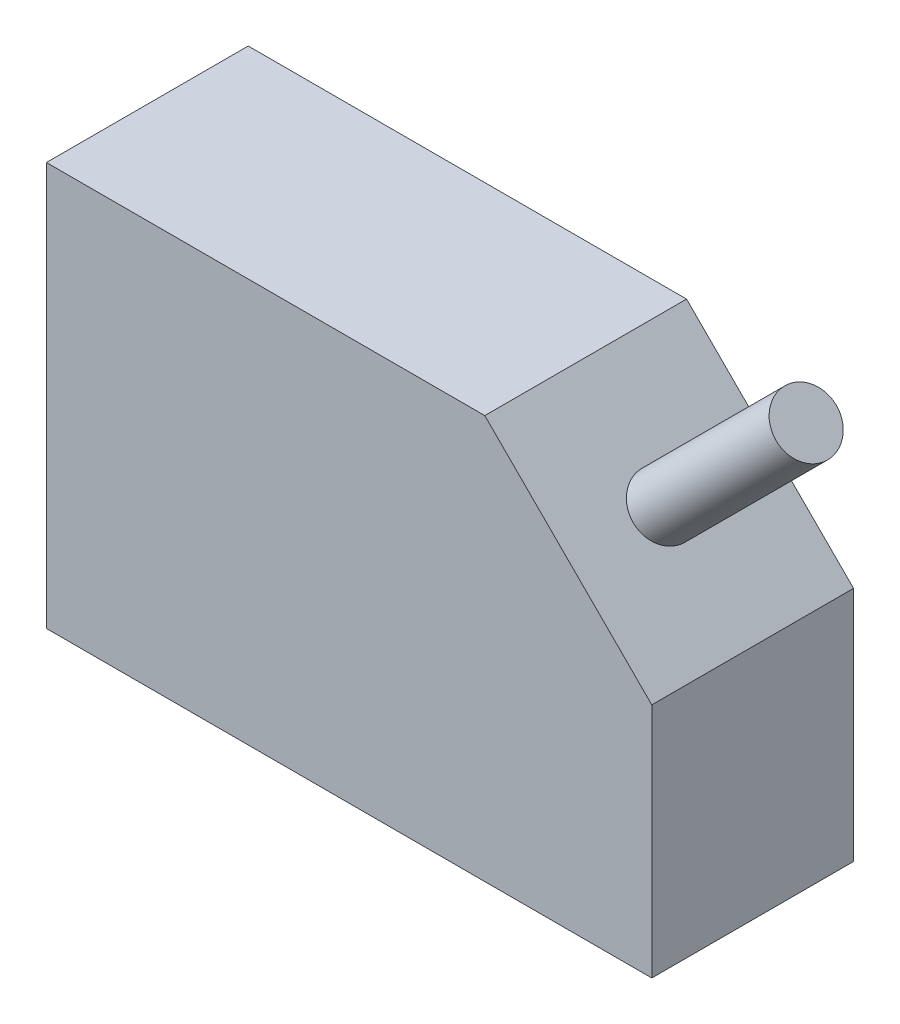
ISO-10303-21;
HEADER;
FILE_DESCRIPTION(('STEP AP214'),'2;1');
FILE_NAME('part.step','',(''),(''),'','','');
FILE_SCHEMA(('AUTOMOTIVE_DESIGN { 1 0 10303 214 1 1 1 1 }'));
ENDSEC;
DATA;
#1=APPLICATION_CONTEXT('core data for automotive mechanical design processes');
#2=APPLICATION_PROTOCOL_DEFINITION('international standard','automotive_design',2000,#1);
#3=PRODUCT_CONTEXT('',#1,'mechanical');
#4=PRODUCT('Part','Part','',(#3));
#5=PRODUCT_RELATED_PRODUCT_CATEGORY('part','',(#4));
#6=PRODUCT_DEFINITION_FORMATION('','',#4);
#7=PRODUCT_DEFINITION_CONTEXT('part definition',#1,'design');
#8=PRODUCT_DEFINITION('design','',#6,#7);
#9=PRODUCT_DEFINITION_SHAPE('','',#8);
#10=(LENGTH_UNIT() NAMED_UNIT(*) SI_UNIT(.MILLI.,.METRE.));
#11=(NAMED_UNIT(*) PLANE_ANGLE_UNIT() SI_UNIT($,.RADIAN.));
#12=(NAMED_UNIT(*) SI_UNIT($,.STERADIAN.) SOLID_ANGLE_UNIT());
#13=UNCERTAINTY_MEASURE_WITH_UNIT(LENGTH_MEASURE(1.E-05),#10,'distance_accuracy_value','');
#14=(GEOMETRIC_REPRESENTATION_CONTEXT(3) GLOBAL_UNCERTAINTY_ASSIGNED_CONTEXT((#13)) GLOBAL_UNIT_ASSIGNED_CONTEXT((#10,
#11,#12)) REPRESENTATION_CONTEXT('',''));
#15=CARTESIAN_POINT('',(0.,0.,0.));
#16=DIRECTION('',(0.,0.,1.));
#17=DIRECTION('',(1.,0.,0.));
#18=AXIS2_PLACEMENT_3D('',#15,#16,#17);
#19=CARTESIAN_POINT('',(6.72403137627764,10.,10.));
#20=DIRECTION('',(0.707106781186539,0.707106781186556,0.));
#21=DIRECTION('',(-0.707106781186556,0.707106781186539,0.));
#22=AXIS2_PLACEMENT_3D('',#19,#20,#21);
#23=PLANE('',#22);
#24=CARTESIAN_POINT('',(10.8620156881388,5.86201568813892,5.28233680022071));
#25=DIRECTION('',(0.707106781186539,0.707106781186556,0.));
#26=DIRECTION('',(-0.707106781186556,0.707106781186539,0.));
#27=AXIS2_PLACEMENT_3D('',#24,#25,#26);
#28=CIRCLE('',#27,1.5);
#29=CARTESIAN_POINT('',(9.80135551635899,6.92267585991872,5.28233680022071));
#30=VERTEX_POINT('',#29);
#31=EDGE_CURVE('E11',#30,#30,#28,.T.);
#32=ORIENTED_EDGE('',*,*,#31,.F.);
#33=EDGE_LOOP('',(#32));
#34=FACE_BOUND('',#33,.T.);
#35=DIRECTION('',(0.707106781186556,-0.707106781186539,0.));
#36=VECTOR('',#35,1.);
#37=CARTESIAN_POINT('',(6.72403137627764,10.,0.));
#38=LINE('',#37,#36);
#39=CARTESIAN_POINT('',(6.72403137627764,10.,0.));
#40=VERTEX_POINT('',#39);
#41=CARTESIAN_POINT('',(15.,1.72403137627784,0.));
#42=VERTEX_POINT('',#41);
#43=EDGE_CURVE('E110',#40,#42,#38,.T.);
#44=ORIENTED_EDGE('',*,*,#43,.F.);
#45=DIRECTION('',(0.,0.,-1.));
#46=VECTOR('',#45,1.);
#47=CARTESIAN_POINT('',(6.72403137627764,10.,10.));
#48=LINE('',#47,#46);
#49=CARTESIAN_POINT('',(6.72403137627764,10.,10.));
#50=VERTEX_POINT('',#49);
#51=EDGE_CURVE('E40',#50,#40,#48,.T.);
#52=ORIENTED_EDGE('',*,*,#51,.F.);
#53=DIRECTION('',(0.707106781186556,-0.707106781186539,0.));
#54=VECTOR('',#53,1.);
#55=CARTESIAN_POINT('',(6.72403137627764,10.,10.));
#56=LINE('',#55,#54);
#57=CARTESIAN_POINT('',(15.,1.72403137627784,10.));
#58=VERTEX_POINT('',#57);
#59=EDGE_CURVE('E105',#50,#58,#56,.T.);
#60=ORIENTED_EDGE('',*,*,#59,.T.);
#61=DIRECTION('',(0.,0.,-1.));
#62=VECTOR('',#61,1.);
#63=CARTESIAN_POINT('',(15.,1.72403137627784,10.));
#64=LINE('',#63,#62);
#65=EDGE_CURVE('E79',#58,#42,#64,.T.);
#66=ORIENTED_EDGE('',*,*,#65,.T.);
#67=EDGE_LOOP('',(#44,#52,#60,#66));
#68=FACE_BOUND('',#67,.T.);
#69=ADVANCED_FACE('F32',(#34,#68),#23,.T.);
#70=CARTESIAN_POINT('',(-15.,10.,10.));
#71=DIRECTION('',(0.,1.,0.));
#72=DIRECTION('',(0.,0.,1.));
#73=AXIS2_PLACEMENT_3D('',#70,#71,#72);
#74=PLANE('',#73);
#75=DIRECTION('',(1.,0.,0.));
#76=VECTOR('',#75,1.);
#77=CARTESIAN_POINT('',(-15.,10.,0.));
#78=LINE('',#77,#76);
#79=CARTESIAN_POINT('',(-15.,10.,0.));
#80=VERTEX_POINT('',#79);
#81=EDGE_CURVE('E120',#80,#40,#78,.T.);
#82=ORIENTED_EDGE('',*,*,#81,.F.);
#83=DIRECTION('',(0.,0.,-1.));
#84=VECTOR('',#83,1.);
#85=CARTESIAN_POINT('',(-15.,10.,10.));
#86=LINE('',#85,#84);
#87=CARTESIAN_POINT('',(-15.,10.,10.));
#88=VERTEX_POINT('',#87);
#89=EDGE_CURVE('E67',#88,#80,#86,.T.);
#90=ORIENTED_EDGE('',*,*,#89,.F.);
#91=DIRECTION('',(1.,0.,0.));
#92=VECTOR('',#91,1.);
#93=CARTESIAN_POINT('',(-15.,10.,10.));
#94=LINE('',#93,#92);
#95=EDGE_CURVE('E100',#88,#50,#94,.T.);
#96=ORIENTED_EDGE('',*,*,#95,.T.);
#97=ORIENTED_EDGE('',*,*,#51,.T.);
#98=EDGE_LOOP('',(#82,#90,#96,#97));
#99=FACE_BOUND('',#98,.T.);
#100=ADVANCED_FACE('F128',(#99),#74,.T.);
#101=CARTESIAN_POINT('',(-15.,-10.,10.));
#102=DIRECTION('',(-1.,0.,0.));
#103=DIRECTION('',(0.,0.,1.));
#104=AXIS2_PLACEMENT_3D('',#101,#102,#103);
#105=PLANE('',#104);
#106=DIRECTION('',(0.,1.,0.));
#107=VECTOR('',#106,1.);
#108=CARTESIAN_POINT('',(-15.,-10.,0.));
#109=LINE('',#108,#107);
#110=CARTESIAN_POINT('',(-15.,-10.,0.));
#111=VERTEX_POINT('',#110);
#112=EDGE_CURVE('E89',#111,#80,#109,.T.);
#113=ORIENTED_EDGE('',*,*,#112,.F.);
#114=DIRECTION('',(0.,0.,-1.));
#115=VECTOR('',#114,1.);
#116=CARTESIAN_POINT('',(-15.,-10.,10.));
#117=LINE('',#116,#115);
#118=CARTESIAN_POINT('',(-15.,-10.,10.));
#119=VERTEX_POINT('',#118);
#120=EDGE_CURVE('E84',#119,#111,#117,.T.);
#121=ORIENTED_EDGE('',*,*,#120,.F.);
#122=DIRECTION('',(0.,1.,0.));
#123=VECTOR('',#122,1.);
#124=CARTESIAN_POINT('',(-15.,-10.,10.));
#125=LINE('',#124,#123);
#126=EDGE_CURVE('E87',#119,#88,#125,.T.);
#127=ORIENTED_EDGE('',*,*,#126,.T.);
#128=ORIENTED_EDGE('',*,*,#89,.T.);
#129=EDGE_LOOP('',(#113,#121,#127,#128));
#130=FACE_BOUND('',#129,.T.);
#131=ADVANCED_FACE('F86',(#130),#105,.T.);
#132=CARTESIAN_POINT('',(15.,-10.,10.));
#133=DIRECTION('',(0.,-1.,0.));
#134=DIRECTION('',(1.,0.,0.));
#135=AXIS2_PLACEMENT_3D('',#132,#133,#134);
#136=PLANE('',#135);
#137=DIRECTION('',(-1.,0.,0.));
#138=VECTOR('',#137,1.);
#139=CARTESIAN_POINT('',(15.,-10.,0.));
#140=LINE('',#139,#138);
#141=CARTESIAN_POINT('',(15.,-10.,0.));
#142=VERTEX_POINT('',#141);
#143=EDGE_CURVE('E117',#142,#111,#140,.T.);
#144=ORIENTED_EDGE('',*,*,#143,.F.);
#145=DIRECTION('',(0.,0.,-1.));
#146=VECTOR('',#145,1.);
#147=CARTESIAN_POINT('',(15.,-10.,10.));
#148=LINE('',#147,#146);
#149=CARTESIAN_POINT('',(15.,-10.,10.));
#150=VERTEX_POINT('',#149);
#151=EDGE_CURVE('E94',#150,#142,#148,.T.);
#152=ORIENTED_EDGE('',*,*,#151,.F.);
#153=DIRECTION('',(-1.,0.,0.));
#154=VECTOR('',#153,1.);
#155=CARTESIAN_POINT('',(15.,-10.,10.));
#156=LINE('',#155,#154);
#157=EDGE_CURVE('E99',#150,#119,#156,.T.);
#158=ORIENTED_EDGE('',*,*,#157,.T.);
#159=ORIENTED_EDGE('',*,*,#120,.T.);
#160=EDGE_LOOP('',(#144,#152,#158,#159));
#161=FACE_BOUND('',#160,.T.);
#162=ADVANCED_FACE('F102',(#161),#136,.T.);
#163=CARTESIAN_POINT('',(15.,1.72403137627784,10.));
#164=DIRECTION('',(1.,0.,0.));
#165=DIRECTION('',(0.,0.,-1.));
#166=AXIS2_PLACEMENT_3D('',#163,#164,#165);
#167=PLANE('',#166);
#168=DIRECTION('',(0.,-1.,0.));
#169=VECTOR('',#168,1.);
#170=CARTESIAN_POINT('',(15.,1.72403137627784,0.));
#171=LINE('',#170,#169);
#172=EDGE_CURVE('E113',#42,#142,#171,.T.);
#173=ORIENTED_EDGE('',*,*,#172,.F.);
#174=ORIENTED_EDGE('',*,*,#65,.F.);
#175=DIRECTION('',(0.,-1.,0.));
#176=VECTOR('',#175,1.);
#177=CARTESIAN_POINT('',(15.,1.72403137627784,10.));
#178=LINE('',#177,#176);
#179=EDGE_CURVE('E103',#58,#150,#178,.T.);
#180=ORIENTED_EDGE('',*,*,#179,.T.);
#181=ORIENTED_EDGE('',*,*,#151,.T.);
#182=EDGE_LOOP('',(#173,#174,#180,#181));
#183=FACE_BOUND('',#182,.T.);
#184=ADVANCED_FACE('F125',(#183),#167,.T.);
#185=CARTESIAN_POINT('',(0.,0.,10.));
#186=DIRECTION('',(0.,0.,-1.));
#187=DIRECTION('',(-1.,0.,0.));
#188=AXIS2_PLACEMENT_3D('',#185,#186,#187);
#189=PLANE('',#188);
#190=ORIENTED_EDGE('',*,*,#59,.F.);
#191=ORIENTED_EDGE('',*,*,#95,.F.);
#192=ORIENTED_EDGE('',*,*,#126,.F.);
#193=ORIENTED_EDGE('',*,*,#157,.F.);
#194=ORIENTED_EDGE('',*,*,#179,.F.);
#195=EDGE_LOOP('',(#190,#191,#192,#193,#194));
#196=FACE_BOUND('',#195,.T.);
#197=ADVANCED_FACE('F98',(#196),#189,.F.);
#198=CARTESIAN_POINT('',(0.,0.,0.));
#199=DIRECTION('',(0.,0.,-1.));
#200=DIRECTION('',(-1.,0.,0.));
#201=AXIS2_PLACEMENT_3D('',#198,#199,#200);
#202=PLANE('',#201);
#203=ORIENTED_EDGE('',*,*,#43,.T.);
#204=ORIENTED_EDGE('',*,*,#172,.T.);
#205=ORIENTED_EDGE('',*,*,#143,.T.);
#206=ORIENTED_EDGE('',*,*,#112,.T.);
#207=ORIENTED_EDGE('',*,*,#81,.T.);
#208=EDGE_LOOP('',(#203,#204,#205,#206,#207));
#209=FACE_BOUND('',#208,.T.);
#210=ADVANCED_FACE('F127',(#209),#202,.T.);
#211=CARTESIAN_POINT('',(18.4634135858941,13.4634135858944,5.28233680022071));
#212=DIRECTION('',(-0.707106781186539,-0.707106781186556,0.));
#213=DIRECTION('',(0.707106781186556,-0.707106781186539,0.));
#214=AXIS2_PLACEMENT_3D('',#211,#212,#213);
#215=CYLINDRICAL_SURFACE('',#214,1.5);
#216=CARTESIAN_POINT('',(17.9330835000042,12.9330835000045,5.28233680022071));
#217=DIRECTION('',(-0.707106781186539,-0.707106781186556,0.));
#218=DIRECTION('',(0.707106781186556,-0.707106781186539,0.));
#219=AXIS2_PLACEMENT_3D('',#216,#217,#218);
#220=CIRCLE('',#219,1.5);
#221=CARTESIAN_POINT('',(18.993743671784,11.8724233282247,5.28233680022071));
#222=VERTEX_POINT('',#221);
#223=EDGE_CURVE('E114',#222,#222,#220,.T.);
#224=ORIENTED_EDGE('',*,*,#223,.T.);
#225=EDGE_LOOP('',(#224));
#226=FACE_BOUND('',#225,.T.);
#227=ORIENTED_EDGE('',*,*,#31,.T.);
#228=EDGE_LOOP('',(#227));
#229=FACE_BOUND('',#228,.T.);
#230=ADVANCED_FACE('F148',(#226,#229),#215,.T.);
#231=CARTESIAN_POINT('',(18.993743671784,11.8724233282247,5.28233680022071));
#232=DIRECTION('',(0.707106781186539,0.707106781186556,0.));
#233=DIRECTION('',(-0.707106781186556,0.707106781186539,0.));
#234=AXIS2_PLACEMENT_3D('',#231,#232,#233);
#235=PLANE('',#234);
#236=ORIENTED_EDGE('',*,*,#223,.F.);
#237=EDGE_LOOP('',(#236));
#238=FACE_BOUND('',#237,.T.);
#239=ADVANCED_FACE('F152',(#238),#235,.T.);
#240=CLOSED_SHELL('',(#69,#100,#131,#162,#184,#197,#210,#230,#239));
#241=MANIFOLD_SOLID_BREP('B2',#240);
#242=ADVANCED_BREP_SHAPE_REPRESENTATION('',(#18,#241),#14);
#243=SHAPE_DEFINITION_REPRESENTATION(#9,#242);
ENDSEC;
END-ISO-10303-21;
